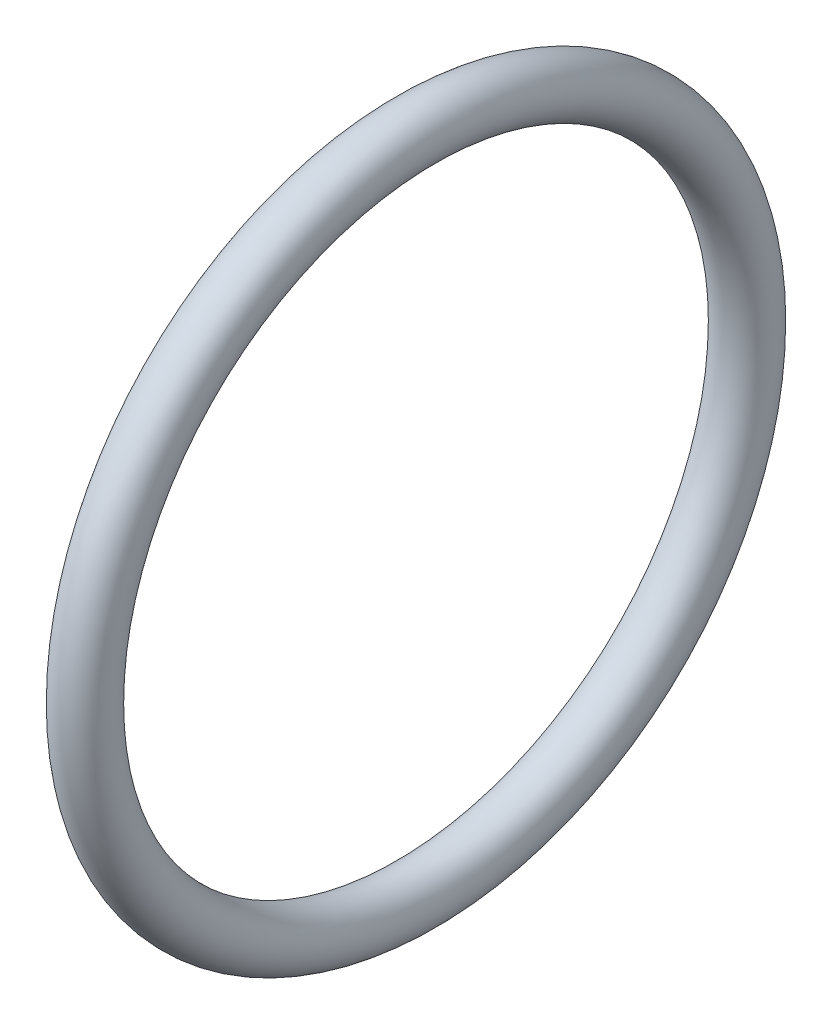
ISO-10303-21;
HEADER;
FILE_DESCRIPTION(('STEP AP214'),'2;1');
FILE_NAME('part.step','',(''),(''),'','','');
FILE_SCHEMA(('AUTOMOTIVE_DESIGN { 1 0 10303 214 1 1 1 1 }'));
ENDSEC;
DATA;
#1=APPLICATION_CONTEXT('core data for automotive mechanical design processes');
#2=APPLICATION_PROTOCOL_DEFINITION('international standard','automotive_design',2000,#1);
#3=PRODUCT_CONTEXT('',#1,'mechanical');
#4=PRODUCT('Part','Part','',(#3));
#5=PRODUCT_RELATED_PRODUCT_CATEGORY('part','',(#4));
#6=PRODUCT_DEFINITION_FORMATION('','',#4);
#7=PRODUCT_DEFINITION_CONTEXT('part definition',#1,'design');
#8=PRODUCT_DEFINITION('design','',#6,#7);
#9=PRODUCT_DEFINITION_SHAPE('','',#8);
#10=(LENGTH_UNIT() NAMED_UNIT(*) SI_UNIT(.MILLI.,.METRE.));
#11=(NAMED_UNIT(*) PLANE_ANGLE_UNIT() SI_UNIT($,.RADIAN.));
#12=(NAMED_UNIT(*) SI_UNIT($,.STERADIAN.) SOLID_ANGLE_UNIT());
#13=UNCERTAINTY_MEASURE_WITH_UNIT(LENGTH_MEASURE(1.E-05),#10,'distance_accuracy_value','');
#14=(GEOMETRIC_REPRESENTATION_CONTEXT(3) GLOBAL_UNCERTAINTY_ASSIGNED_CONTEXT((#13)) GLOBAL_UNIT_ASSIGNED_CONTEXT((#10,
#11,#12)) REPRESENTATION_CONTEXT('',''));
#15=CARTESIAN_POINT('',(0.,0.,0.));
#16=DIRECTION('',(0.,0.,1.));
#17=DIRECTION('',(1.,0.,0.));
#18=AXIS2_PLACEMENT_3D('',#15,#16,#17);
#19=CARTESIAN_POINT('',(0.,0.,0.));
#20=DIRECTION('',(-1.,0.,0.));
#21=DIRECTION('',(0.,0.,1.));
#22=AXIS2_PLACEMENT_3D('',#19,#20,#21);
#23=TOROIDAL_SURFACE('',#22,18.75,1.55);
#24=CARTESIAN_POINT('',(0.,0.,20.3));
#25=VERTEX_POINT('',#24);
#26=VERTEX_LOOP('',#25);
#27=FACE_BOUND('',#26,.T.);
#28=ADVANCED_FACE('F37',(#27),#23,.T.);
#29=CLOSED_SHELL('',(#28));
#30=MANIFOLD_SOLID_BREP('B2',#29);
#31=ADVANCED_BREP_SHAPE_REPRESENTATION('',(#18,#30),#14);
#32=SHAPE_DEFINITION_REPRESENTATION(#9,#31);
ENDSEC;
END-ISO-10303-21;
